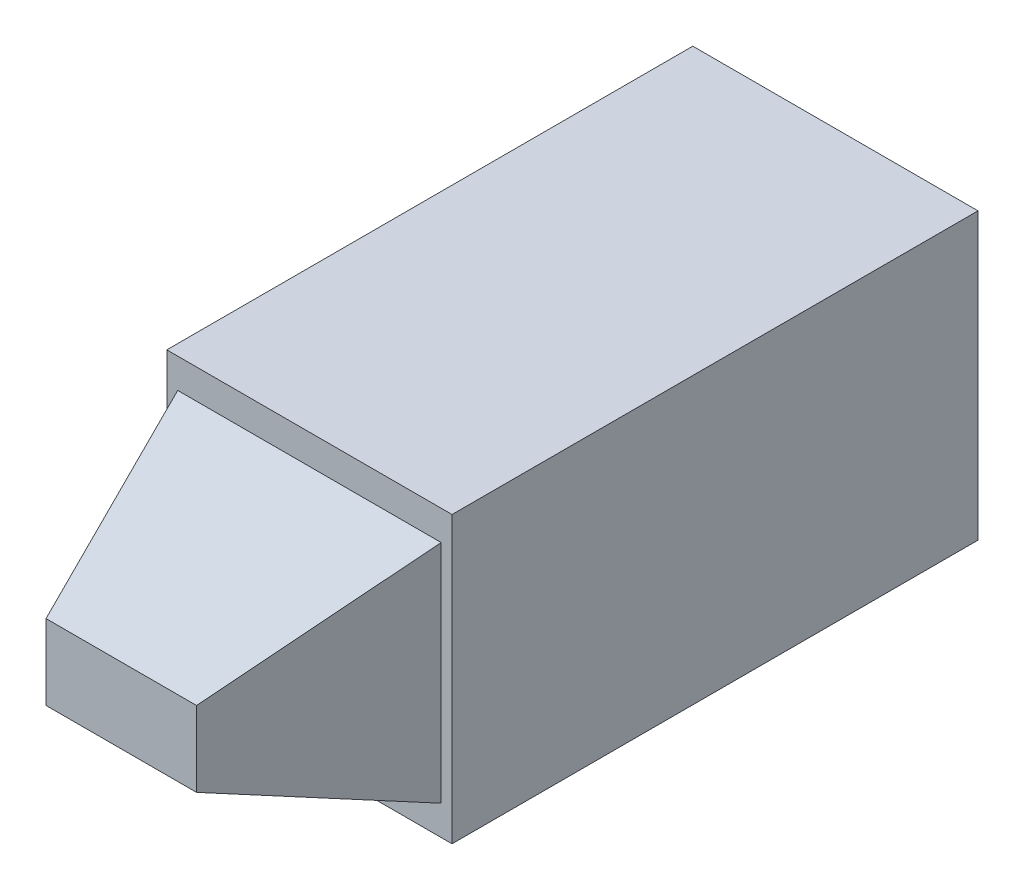
ISO-10303-21;
HEADER;
FILE_DESCRIPTION(('STEP AP214'),'2;1');
FILE_NAME('part.step','',(''),(''),'','','');
FILE_SCHEMA(('AUTOMOTIVE_DESIGN { 1 0 10303 214 1 1 1 1 }'));
ENDSEC;
DATA;
#1=APPLICATION_CONTEXT('core data for automotive mechanical design processes');
#2=APPLICATION_PROTOCOL_DEFINITION('international standard','automotive_design',2000,#1);
#3=PRODUCT_CONTEXT('',#1,'mechanical');
#4=PRODUCT('Part','Part','',(#3));
#5=PRODUCT_RELATED_PRODUCT_CATEGORY('part','',(#4));
#6=PRODUCT_DEFINITION_FORMATION('','',#4);
#7=PRODUCT_DEFINITION_CONTEXT('part definition',#1,'design');
#8=PRODUCT_DEFINITION('design','',#6,#7);
#9=PRODUCT_DEFINITION_SHAPE('','',#8);
#10=(LENGTH_UNIT() NAMED_UNIT(*) SI_UNIT(.MILLI.,.METRE.));
#11=(NAMED_UNIT(*) PLANE_ANGLE_UNIT() SI_UNIT($,.RADIAN.));
#12=(NAMED_UNIT(*) SI_UNIT($,.STERADIAN.) SOLID_ANGLE_UNIT());
#13=UNCERTAINTY_MEASURE_WITH_UNIT(LENGTH_MEASURE(1.E-05),#10,'distance_accuracy_value','');
#14=(GEOMETRIC_REPRESENTATION_CONTEXT(3) GLOBAL_UNCERTAINTY_ASSIGNED_CONTEXT((#13)) GLOBAL_UNIT_ASSIGNED_CONTEXT((#10,
#11,#12)) REPRESENTATION_CONTEXT('',''));
#15=CARTESIAN_POINT('',(0.,0.,0.));
#16=DIRECTION('',(0.,0.,1.));
#17=DIRECTION('',(1.,0.,0.));
#18=AXIS2_PLACEMENT_3D('',#15,#16,#17);
#19=CARTESIAN_POINT('',(-101.6,-50.8,254.));
#20=DIRECTION('',(0.,0.,1.));
#21=DIRECTION('',(1.,0.,0.));
#22=AXIS2_PLACEMENT_3D('',#19,#20,#21);
#23=PLANE('',#22);
#24=DIRECTION('',(0.,1.,0.));
#25=VECTOR('',#24,1.);
#26=CARTESIAN_POINT('',(101.6,-154.2288,254.));
#27=LINE('',#26,#25);
#28=CARTESIAN_POINT('',(101.6,50.7999999803879,254.000000002155));
#29=VERTEX_POINT('',#28);
#30=CARTESIAN_POINT('',(101.6,-50.7999999928026,254.000000002181));
#31=VERTEX_POINT('',#30);
#32=EDGE_CURVE('E75',#29,#31,#27,.F.);
#33=ORIENTED_EDGE('',*,*,#32,.F.);
#34=DIRECTION('',(1.,0.,0.));
#35=VECTOR('',#34,1.);
#36=CARTESIAN_POINT('',(-179.9336,50.7999999965517,254.000000008621));
#37=LINE('',#36,#35);
#38=CARTESIAN_POINT('',(-101.599999997913,50.7999999775806,254.000000009179));
#39=VERTEX_POINT('',#38);
#40=EDGE_CURVE('E69',#39,#29,#37,.T.);
#41=ORIENTED_EDGE('',*,*,#40,.F.);
#42=DIRECTION('',(0.,1.,0.));
#43=VECTOR('',#42,1.);
#44=CARTESIAN_POINT('',(-101.599999991651,-154.2288,254.000000028095));
#45=LINE('',#44,#43);
#46=CARTESIAN_POINT('',(-101.599999945604,-50.7999999982552,254.000000011386));
#47=VERTEX_POINT('',#46);
#48=EDGE_CURVE('E147',#47,#39,#45,.T.);
#49=ORIENTED_EDGE('',*,*,#48,.F.);
#50=DIRECTION('',(1.,0.,0.));
#51=VECTOR('',#50,1.);
#52=CARTESIAN_POINT('',(-179.9336,-50.7999999965103,254.000000008724));
#53=LINE('',#52,#51);
#54=EDGE_CURVE('E38',#31,#47,#53,.F.);
#55=ORIENTED_EDGE('',*,*,#54,.F.);
#56=EDGE_LOOP('',(#33,#41,#49,#55));
#57=FACE_BOUND('',#56,.T.);
#58=ADVANCED_FACE('F35',(#57),#23,.T.);
#59=CARTESIAN_POINT('',(-179.9336,-50.8,254.));
#60=DIRECTION('',(0.,-0.928476690885259,0.371390676354104));
#61=DIRECTION('',(0.,-0.371390676354104,-0.928476690885259));
#62=AXIS2_PLACEMENT_3D('',#59,#60,#61);
#63=PLANE('',#62);
#64=ORIENTED_EDGE('',*,*,#54,.T.);
#65=DIRECTION('',(0.268328157303514,0.357770876365485,0.894427191012647));
#66=VECTOR('',#65,1.);
#67=CARTESIAN_POINT('',(-177.8,-152.4,0.));
#68=LINE('',#67,#66);
#69=CARTESIAN_POINT('',(-177.8,-152.4,0.));
#70=VERTEX_POINT('',#69);
#71=EDGE_CURVE('E149',#70,#47,#68,.T.);
#72=ORIENTED_EDGE('',*,*,#71,.F.);
#73=DIRECTION('',(1.,0.,0.));
#74=VECTOR('',#73,1.);
#75=CARTESIAN_POINT('',(-177.8,-152.4,0.));
#76=LINE('',#75,#74);
#77=CARTESIAN_POINT('',(177.79999999992,-152.4,0.));
#78=VERTEX_POINT('',#77);
#79=EDGE_CURVE('E53',#70,#78,#76,.T.);
#80=ORIENTED_EDGE('',*,*,#79,.T.);
#81=DIRECTION('',(0.268328157291165,-0.357770876477653,-0.894427190971484));
#82=VECTOR('',#81,1.);
#83=CARTESIAN_POINT('',(101.6,-50.7999999747,254.));
#84=LINE('',#83,#82);
#85=EDGE_CURVE('E155',#31,#78,#84,.T.);
#86=ORIENTED_EDGE('',*,*,#85,.F.);
#87=EDGE_LOOP('',(#64,#72,#80,#86));
#88=FACE_BOUND('',#87,.T.);
#89=ADVANCED_FACE('F159',(#88),#63,.T.);
#90=CARTESIAN_POINT('',(101.6,-154.2288,254.));
#91=DIRECTION('',(0.957826285221234,0.,0.28734788556607));
#92=DIRECTION('',(0.28734788556607,0.,-0.957826285221234));
#93=AXIS2_PLACEMENT_3D('',#90,#91,#92);
#94=PLANE('',#93);
#95=DIRECTION('',(0.,1.,0.));
#96=VECTOR('',#95,1.);
#97=CARTESIAN_POINT('',(177.8,-152.4,0.));
#98=LINE('',#97,#96);
#99=CARTESIAN_POINT('',(177.8,152.4,0.));
#100=VERTEX_POINT('',#99);
#101=EDGE_CURVE('E80',#78,#100,#98,.T.);
#102=ORIENTED_EDGE('',*,*,#101,.T.);
#103=DIRECTION('',(0.268328157291523,0.357770876400841,-0.894427191002102));
#104=VECTOR('',#103,1.);
#105=CARTESIAN_POINT('',(101.6,50.7999999965517,254.000000008621));
#106=LINE('',#105,#104);
#107=EDGE_CURVE('E152',#29,#100,#106,.T.);
#108=ORIENTED_EDGE('',*,*,#107,.F.);
#109=ORIENTED_EDGE('',*,*,#32,.T.);
#110=ORIENTED_EDGE('',*,*,#85,.T.);
#111=EDGE_LOOP('',(#102,#108,#109,#110));
#112=FACE_BOUND('',#111,.T.);
#113=ADVANCED_FACE('F157',(#112),#94,.T.);
#114=CARTESIAN_POINT('',(-179.9336,152.4,0.));
#115=DIRECTION('',(0.,0.928476690885259,0.371390676354104));
#116=DIRECTION('',(0.,-0.371390676354104,0.928476690885259));
#117=AXIS2_PLACEMENT_3D('',#114,#115,#116);
#118=PLANE('',#117);
#119=DIRECTION('',(1.,0.,0.));
#120=VECTOR('',#119,1.);
#121=CARTESIAN_POINT('',(-177.8,152.4,0.));
#122=LINE('',#121,#120);
#123=CARTESIAN_POINT('',(-177.8,152.4,0.));
#124=VERTEX_POINT('',#123);
#125=EDGE_CURVE('E44',#100,#124,#122,.F.);
#126=ORIENTED_EDGE('',*,*,#125,.T.);
#127=DIRECTION('',(-0.268328157291266,0.357770876476732,-0.894427190971822));
#128=VECTOR('',#127,1.);
#129=CARTESIAN_POINT('',(-101.600000000073,50.799999975,254.000000000022));
#130=LINE('',#129,#128);
#131=EDGE_CURVE('E144',#39,#124,#130,.T.);
#132=ORIENTED_EDGE('',*,*,#131,.F.);
#133=ORIENTED_EDGE('',*,*,#40,.T.);
#134=ORIENTED_EDGE('',*,*,#107,.T.);
#135=EDGE_LOOP('',(#126,#132,#133,#134));
#136=FACE_BOUND('',#135,.T.);
#137=ADVANCED_FACE('F194',(#136),#118,.T.);
#138=CARTESIAN_POINT('',(-177.8,-154.2288,0.));
#139=DIRECTION('',(-0.957826285221234,0.,0.28734788556607));
#140=DIRECTION('',(0.28734788556607,0.,0.957826285221234));
#141=AXIS2_PLACEMENT_3D('',#138,#139,#140);
#142=PLANE('',#141);
#143=ORIENTED_EDGE('',*,*,#48,.T.);
#144=ORIENTED_EDGE('',*,*,#131,.T.);
#145=DIRECTION('',(0.,1.,0.));
#146=VECTOR('',#145,1.);
#147=CARTESIAN_POINT('',(-177.8,-152.4,0.));
#148=LINE('',#147,#146);
#149=EDGE_CURVE('E11',#124,#70,#148,.F.);
#150=ORIENTED_EDGE('',*,*,#149,.T.);
#151=ORIENTED_EDGE('',*,*,#71,.T.);
#152=EDGE_LOOP('',(#143,#144,#150,#151));
#153=FACE_BOUND('',#152,.T.);
#154=ADVANCED_FACE('F162',(#153),#142,.T.);
#155=CARTESIAN_POINT('',(-192.5,-192.5,-710.));
#156=DIRECTION('',(1.,0.,0.));
#157=DIRECTION('',(0.,0.,-1.));
#158=AXIS2_PLACEMENT_3D('',#155,#156,#157);
#159=PLANE('',#158);
#160=DIRECTION('',(0.,1.,0.));
#161=VECTOR('',#160,1.);
#162=CARTESIAN_POINT('',(-192.5,-192.5,0.));
#163=LINE('',#162,#161);
#164=CARTESIAN_POINT('',(-192.5,-192.5,0.));
#165=VERTEX_POINT('',#164);
#166=CARTESIAN_POINT('',(-192.5,192.5,0.));
#167=VERTEX_POINT('',#166);
#168=EDGE_CURVE('E135',#165,#167,#163,.T.);
#169=ORIENTED_EDGE('',*,*,#168,.T.);
#170=DIRECTION('',(0.,0.,1.));
#171=VECTOR('',#170,1.);
#172=CARTESIAN_POINT('',(-192.5,192.5,-710.));
#173=LINE('',#172,#171);
#174=CARTESIAN_POINT('',(-192.5,192.5,-710.));
#175=VERTEX_POINT('',#174);
#176=EDGE_CURVE('E115',#175,#167,#173,.T.);
#177=ORIENTED_EDGE('',*,*,#176,.F.);
#178=DIRECTION('',(0.,1.,0.));
#179=VECTOR('',#178,1.);
#180=CARTESIAN_POINT('',(-192.5,-192.5,-710.));
#181=LINE('',#180,#179);
#182=CARTESIAN_POINT('',(-192.5,-192.5,-710.));
#183=VERTEX_POINT('',#182);
#184=EDGE_CURVE('E122',#183,#175,#181,.T.);
#185=ORIENTED_EDGE('',*,*,#184,.F.);
#186=DIRECTION('',(0.,0.,1.));
#187=VECTOR('',#186,1.);
#188=CARTESIAN_POINT('',(-192.5,-192.5,-710.));
#189=LINE('',#188,#187);
#190=EDGE_CURVE('E178',#183,#165,#189,.T.);
#191=ORIENTED_EDGE('',*,*,#190,.T.);
#192=EDGE_LOOP('',(#169,#177,#185,#191));
#193=FACE_BOUND('',#192,.T.);
#194=ADVANCED_FACE('F133',(#193),#159,.F.);
#195=CARTESIAN_POINT('',(192.5,192.5,-710.));
#196=DIRECTION('',(0.,-1.,0.));
#197=DIRECTION('',(0.,0.,-1.));
#198=AXIS2_PLACEMENT_3D('',#195,#196,#197);
#199=PLANE('',#198);
#200=DIRECTION('',(1.,0.,0.));
#201=VECTOR('',#200,1.);
#202=CARTESIAN_POINT('',(192.5,192.5,0.));
#203=LINE('',#202,#201);
#204=CARTESIAN_POINT('',(192.5,192.5,0.));
#205=VERTEX_POINT('',#204);
#206=EDGE_CURVE('E169',#167,#205,#203,.T.);
#207=ORIENTED_EDGE('',*,*,#206,.T.);
#208=DIRECTION('',(0.,0.,1.));
#209=VECTOR('',#208,1.);
#210=CARTESIAN_POINT('',(192.5,192.5,-710.));
#211=LINE('',#210,#209);
#212=CARTESIAN_POINT('',(192.5,192.5,-710.));
#213=VERTEX_POINT('',#212);
#214=EDGE_CURVE('E118',#213,#205,#211,.T.);
#215=ORIENTED_EDGE('',*,*,#214,.F.);
#216=DIRECTION('',(1.,0.,0.));
#217=VECTOR('',#216,1.);
#218=CARTESIAN_POINT('',(192.5,192.5,-710.));
#219=LINE('',#218,#217);
#220=EDGE_CURVE('E111',#175,#213,#219,.T.);
#221=ORIENTED_EDGE('',*,*,#220,.F.);
#222=ORIENTED_EDGE('',*,*,#176,.T.);
#223=EDGE_LOOP('',(#207,#215,#221,#222));
#224=FACE_BOUND('',#223,.T.);
#225=ADVANCED_FACE('F113',(#224),#199,.F.);
#226=CARTESIAN_POINT('',(192.5,-192.5,-710.));
#227=DIRECTION('',(-1.,0.,0.));
#228=DIRECTION('',(0.,0.,1.));
#229=AXIS2_PLACEMENT_3D('',#226,#227,#228);
#230=PLANE('',#229);
#231=DIRECTION('',(0.,-1.,0.));
#232=VECTOR('',#231,1.);
#233=CARTESIAN_POINT('',(192.5,-192.5,0.));
#234=LINE('',#233,#232);
#235=CARTESIAN_POINT('',(192.5,-192.5,0.));
#236=VERTEX_POINT('',#235);
#237=EDGE_CURVE('E171',#205,#236,#234,.T.);
#238=ORIENTED_EDGE('',*,*,#237,.T.);
#239=DIRECTION('',(0.,0.,1.));
#240=VECTOR('',#239,1.);
#241=CARTESIAN_POINT('',(192.5,-192.5,-710.));
#242=LINE('',#241,#240);
#243=CARTESIAN_POINT('',(192.5,-192.5,-710.));
#244=VERTEX_POINT('',#243);
#245=EDGE_CURVE('E137',#244,#236,#242,.T.);
#246=ORIENTED_EDGE('',*,*,#245,.F.);
#247=DIRECTION('',(0.,-1.,0.));
#248=VECTOR('',#247,1.);
#249=CARTESIAN_POINT('',(192.5,-192.5,-710.));
#250=LINE('',#249,#248);
#251=EDGE_CURVE('E121',#213,#244,#250,.T.);
#252=ORIENTED_EDGE('',*,*,#251,.F.);
#253=ORIENTED_EDGE('',*,*,#214,.T.);
#254=EDGE_LOOP('',(#238,#246,#252,#253));
#255=FACE_BOUND('',#254,.T.);
#256=ADVANCED_FACE('F184',(#255),#230,.F.);
#257=CARTESIAN_POINT('',(192.5,-192.5,-710.));
#258=DIRECTION('',(0.,1.,0.));
#259=DIRECTION('',(0.,0.,1.));
#260=AXIS2_PLACEMENT_3D('',#257,#258,#259);
#261=PLANE('',#260);
#262=DIRECTION('',(-1.,0.,0.));
#263=VECTOR('',#262,1.);
#264=CARTESIAN_POINT('',(192.5,-192.5,0.));
#265=LINE('',#264,#263);
#266=EDGE_CURVE('E131',#236,#165,#265,.T.);
#267=ORIENTED_EDGE('',*,*,#266,.T.);
#268=ORIENTED_EDGE('',*,*,#190,.F.);
#269=DIRECTION('',(-1.,0.,0.));
#270=VECTOR('',#269,1.);
#271=CARTESIAN_POINT('',(192.5,-192.5,-710.));
#272=LINE('',#271,#270);
#273=EDGE_CURVE('E127',#244,#183,#272,.T.);
#274=ORIENTED_EDGE('',*,*,#273,.F.);
#275=ORIENTED_EDGE('',*,*,#245,.T.);
#276=EDGE_LOOP('',(#267,#268,#274,#275));
#277=FACE_BOUND('',#276,.T.);
#278=ADVANCED_FACE('F182',(#277),#261,.F.);
#279=CARTESIAN_POINT('',(0.,0.,-710.));
#280=DIRECTION('',(0.,0.,1.));
#281=DIRECTION('',(1.,0.,0.));
#282=AXIS2_PLACEMENT_3D('',#279,#280,#281);
#283=PLANE('',#282);
#284=ORIENTED_EDGE('',*,*,#184,.T.);
#285=ORIENTED_EDGE('',*,*,#220,.T.);
#286=ORIENTED_EDGE('',*,*,#251,.T.);
#287=ORIENTED_EDGE('',*,*,#273,.T.);
#288=EDGE_LOOP('',(#284,#285,#286,#287));
#289=FACE_BOUND('',#288,.T.);
#290=ADVANCED_FACE('F125',(#289),#283,.F.);
#291=CARTESIAN_POINT('',(0.,0.,0.));
#292=DIRECTION('',(0.,0.,1.));
#293=DIRECTION('',(1.,0.,0.));
#294=AXIS2_PLACEMENT_3D('',#291,#292,#293);
#295=PLANE('',#294);
#296=ORIENTED_EDGE('',*,*,#101,.F.);
#297=ORIENTED_EDGE('',*,*,#79,.F.);
#298=ORIENTED_EDGE('',*,*,#149,.F.);
#299=ORIENTED_EDGE('',*,*,#125,.F.);
#300=EDGE_LOOP('',(#296,#297,#298,#299));
#301=FACE_BOUND('',#300,.T.);
#302=ORIENTED_EDGE('',*,*,#168,.F.);
#303=ORIENTED_EDGE('',*,*,#266,.F.);
#304=ORIENTED_EDGE('',*,*,#237,.F.);
#305=ORIENTED_EDGE('',*,*,#206,.F.);
#306=EDGE_LOOP('',(#302,#303,#304,#305));
#307=FACE_BOUND('',#306,.T.);
#308=ADVANCED_FACE('F163',(#301,#307),#295,.T.);
#309=CLOSED_SHELL('',(#58,#89,#113,#137,#154,#194,#225,#256,#278,#290,#308));
#310=MANIFOLD_SOLID_BREP('B2',#309);
#311=ADVANCED_BREP_SHAPE_REPRESENTATION('',(#18,#310),#14);
#312=SHAPE_DEFINITION_REPRESENTATION(#9,#311);
ENDSEC;
END-ISO-10303-21;
